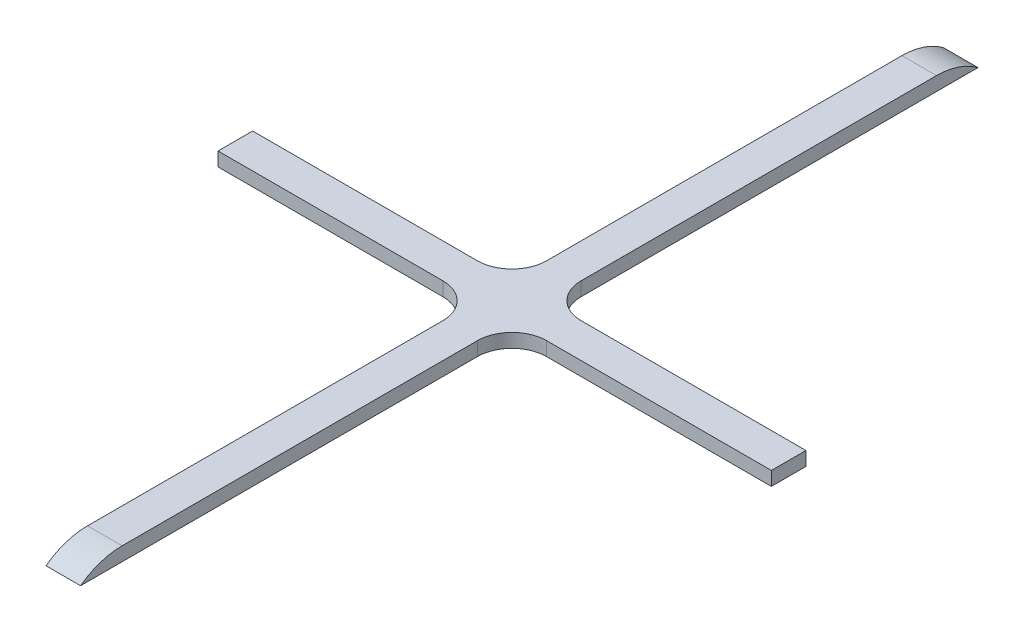
ISO-10303-21;
HEADER;
FILE_DESCRIPTION(('STEP AP214'),'2;1');
FILE_NAME('part.step','',(''),(''),'','','');
FILE_SCHEMA(('AUTOMOTIVE_DESIGN { 1 0 10303 214 1 1 1 1 }'));
ENDSEC;
DATA;
#1=APPLICATION_CONTEXT('core data for automotive mechanical design processes');
#2=APPLICATION_PROTOCOL_DEFINITION('international standard','automotive_design',2000,#1);
#3=PRODUCT_CONTEXT('',#1,'mechanical');
#4=PRODUCT('Part','Part','',(#3));
#5=PRODUCT_RELATED_PRODUCT_CATEGORY('part','',(#4));
#6=PRODUCT_DEFINITION_FORMATION('','',#4);
#7=PRODUCT_DEFINITION_CONTEXT('part definition',#1,'design');
#8=PRODUCT_DEFINITION('design','',#6,#7);
#9=PRODUCT_DEFINITION_SHAPE('','',#8);
#10=(LENGTH_UNIT() NAMED_UNIT(*) SI_UNIT(.MILLI.,.METRE.));
#11=(NAMED_UNIT(*) PLANE_ANGLE_UNIT() SI_UNIT($,.RADIAN.));
#12=(NAMED_UNIT(*) SI_UNIT($,.STERADIAN.) SOLID_ANGLE_UNIT());
#13=UNCERTAINTY_MEASURE_WITH_UNIT(LENGTH_MEASURE(1.E-05),#10,'distance_accuracy_value','');
#14=(GEOMETRIC_REPRESENTATION_CONTEXT(3) GLOBAL_UNCERTAINTY_ASSIGNED_CONTEXT((#13)) GLOBAL_UNIT_ASSIGNED_CONTEXT((#10,
#11,#12)) REPRESENTATION_CONTEXT('',''));
#15=CARTESIAN_POINT('',(0.,0.,0.));
#16=DIRECTION('',(0.,0.,1.));
#17=DIRECTION('',(1.,0.,0.));
#18=AXIS2_PLACEMENT_3D('',#15,#16,#17);
#19=CARTESIAN_POINT('',(5.,20.,-160.249999999999));
#20=DIRECTION('',(1.,0.,0.));
#21=DIRECTION('',(0.,0.,-1.));
#22=AXIS2_PLACEMENT_3D('',#19,#20,#21);
#23=PLANE('',#22);
#24=DIRECTION('',(0.,0.,-1.));
#25=VECTOR('',#24,1.);
#26=CARTESIAN_POINT('',(5.,36.,87.2500000000012));
#27=LINE('',#26,#25);
#28=CARTESIAN_POINT('',(5.,36.,87.2500000000012));
#29=VERTEX_POINT('',#28);
#30=CARTESIAN_POINT('',(5.,36.,-27.4999999999991));
#31=VERTEX_POINT('',#30);
#32=EDGE_CURVE('E195',#29,#31,#27,.T.);
#33=ORIENTED_EDGE('',*,*,#32,.T.);
#34=DIRECTION('',(0.,1.,0.));
#35=VECTOR('',#34,1.);
#36=CARTESIAN_POINT('',(5.,20.,-27.4999999999991));
#37=LINE('',#36,#35);
#38=CARTESIAN_POINT('',(5.,40.,-27.4999999999991));
#39=VERTEX_POINT('',#38);
#40=EDGE_CURVE('E217',#31,#39,#37,.T.);
#41=ORIENTED_EDGE('',*,*,#40,.T.);
#42=DIRECTION('',(0.,0.,1.));
#43=VECTOR('',#42,1.);
#44=CARTESIAN_POINT('',(5.,40.,75.2500000000012));
#45=LINE('',#44,#43);
#46=CARTESIAN_POINT('',(5.,40.,75.2500000000012));
#47=VERTEX_POINT('',#46);
#48=EDGE_CURVE('E187',#39,#47,#45,.T.);
#49=ORIENTED_EDGE('',*,*,#48,.T.);
#50=CARTESIAN_POINT('',(5.,20.,75.2500000000012));
#51=DIRECTION('',(1.,0.,0.));
#52=DIRECTION('',(0.,0.,-1.));
#53=AXIS2_PLACEMENT_3D('',#50,#51,#52);
#54=CIRCLE('',#53,20.);
#55=EDGE_CURVE('E192',#47,#29,#54,.T.);
#56=ORIENTED_EDGE('',*,*,#55,.T.);
#57=EDGE_LOOP('',(#33,#41,#49,#56));
#58=FACE_BOUND('',#57,.T.);
#59=ADVANCED_FACE('F37',(#58),#23,.T.);
#60=CARTESIAN_POINT('',(5.,40.,-160.249999999999));
#61=VERTEX_POINT('',#60);
#62=CARTESIAN_POINT('',(5.,40.,-57.4999999999991));
#63=VERTEX_POINT('',#62);
#64=EDGE_CURVE('E189',#61,#63,#45,.T.);
#65=ORIENTED_EDGE('',*,*,#64,.T.);
#66=DIRECTION('',(0.,-1.,0.));
#67=VECTOR('',#66,1.);
#68=CARTESIAN_POINT('',(5.,20.,-57.4999999999991));
#69=LINE('',#68,#67);
#70=CARTESIAN_POINT('',(5.,36.,-57.4999999999991));
#71=VERTEX_POINT('',#70);
#72=EDGE_CURVE('E221',#63,#71,#69,.T.);
#73=ORIENTED_EDGE('',*,*,#72,.T.);
#74=CARTESIAN_POINT('',(5.,36.,-172.249999999999));
#75=VERTEX_POINT('',#74);
#76=EDGE_CURVE('E194',#71,#75,#27,.T.);
#77=ORIENTED_EDGE('',*,*,#76,.T.);
#78=CARTESIAN_POINT('',(5.,20.,-160.249999999999));
#79=DIRECTION('',(1.,0.,0.));
#80=DIRECTION('',(0.,0.,-1.));
#81=AXIS2_PLACEMENT_3D('',#78,#79,#80);
#82=CIRCLE('',#81,20.);
#83=EDGE_CURVE('E184',#75,#61,#82,.T.);
#84=ORIENTED_EDGE('',*,*,#83,.T.);
#85=EDGE_LOOP('',(#65,#73,#77,#84));
#86=FACE_BOUND('',#85,.T.);
#87=ADVANCED_FACE('F277',(#86),#23,.T.);
#88=CARTESIAN_POINT('',(-5.,20.,-160.249999999999));
#89=DIRECTION('',(1.,0.,0.));
#90=DIRECTION('',(0.,0.,-1.));
#91=AXIS2_PLACEMENT_3D('',#88,#89,#90);
#92=PLANE('',#91);
#93=DIRECTION('',(0.,0.,1.));
#94=VECTOR('',#93,1.);
#95=CARTESIAN_POINT('',(-5.,40.,75.2500000000012));
#96=LINE('',#95,#94);
#97=CARTESIAN_POINT('',(-5.,40.,-27.4999999999991));
#98=VERTEX_POINT('',#97);
#99=CARTESIAN_POINT('',(-5.,40.,75.2500000000012));
#100=VERTEX_POINT('',#99);
#101=EDGE_CURVE('E179',#98,#100,#96,.T.);
#102=ORIENTED_EDGE('',*,*,#101,.F.);
#103=DIRECTION('',(0.,1.,0.));
#104=VECTOR('',#103,1.);
#105=CARTESIAN_POINT('',(-5.,36.,-27.4999999999991));
#106=LINE('',#105,#104);
#107=CARTESIAN_POINT('',(-5.,36.,-27.4999999999991));
#108=VERTEX_POINT('',#107);
#109=EDGE_CURVE('E58',#98,#108,#106,.F.);
#110=ORIENTED_EDGE('',*,*,#109,.T.);
#111=DIRECTION('',(0.,0.,-1.));
#112=VECTOR('',#111,1.);
#113=CARTESIAN_POINT('',(-5.,36.,87.2500000000012));
#114=LINE('',#113,#112);
#115=CARTESIAN_POINT('',(-5.,36.,87.2500000000012));
#116=VERTEX_POINT('',#115);
#117=EDGE_CURVE('E188',#116,#108,#114,.T.);
#118=ORIENTED_EDGE('',*,*,#117,.F.);
#119=CARTESIAN_POINT('',(-5.,20.,75.2500000000012));
#120=DIRECTION('',(1.,0.,0.));
#121=DIRECTION('',(0.,0.,-1.));
#122=AXIS2_PLACEMENT_3D('',#119,#120,#121);
#123=CIRCLE('',#122,20.);
#124=EDGE_CURVE('E202',#100,#116,#123,.T.);
#125=ORIENTED_EDGE('',*,*,#124,.F.);
#126=EDGE_LOOP('',(#102,#110,#118,#125));
#127=FACE_BOUND('',#126,.T.);
#128=ADVANCED_FACE('F317',(#127),#92,.F.);
#129=CARTESIAN_POINT('',(-5.,36.,-57.4999999999991));
#130=VERTEX_POINT('',#129);
#131=CARTESIAN_POINT('',(-5.,36.,-172.249999999999));
#132=VERTEX_POINT('',#131);
#133=EDGE_CURVE('E204',#130,#132,#114,.T.);
#134=ORIENTED_EDGE('',*,*,#133,.F.);
#135=DIRECTION('',(0.,-1.,0.));
#136=VECTOR('',#135,1.);
#137=CARTESIAN_POINT('',(-5.,40.,-57.4999999999991));
#138=LINE('',#137,#136);
#139=CARTESIAN_POINT('',(-5.,40.,-57.4999999999991));
#140=VERTEX_POINT('',#139);
#141=EDGE_CURVE('E229',#130,#140,#138,.F.);
#142=ORIENTED_EDGE('',*,*,#141,.T.);
#143=CARTESIAN_POINT('',(-5.,40.,-160.249999999999));
#144=VERTEX_POINT('',#143);
#145=EDGE_CURVE('E199',#144,#140,#96,.T.);
#146=ORIENTED_EDGE('',*,*,#145,.F.);
#147=CARTESIAN_POINT('',(-5.,20.,-160.249999999999));
#148=DIRECTION('',(1.,0.,0.));
#149=DIRECTION('',(0.,0.,-1.));
#150=AXIS2_PLACEMENT_3D('',#147,#148,#149);
#151=CIRCLE('',#150,20.);
#152=EDGE_CURVE('E175',#132,#144,#151,.T.);
#153=ORIENTED_EDGE('',*,*,#152,.F.);
#154=EDGE_LOOP('',(#134,#142,#146,#153));
#155=FACE_BOUND('',#154,.T.);
#156=ADVANCED_FACE('F270',(#155),#92,.F.);
#157=CARTESIAN_POINT('',(5.,20.,-160.249999999999));
#158=DIRECTION('',(-1.,0.,0.));
#159=DIRECTION('',(0.,0.,1.));
#160=AXIS2_PLACEMENT_3D('',#157,#158,#159);
#161=CYLINDRICAL_SURFACE('',#160,20.);
#162=ORIENTED_EDGE('',*,*,#152,.T.);
#163=DIRECTION('',(-1.,0.,0.));
#164=VECTOR('',#163,1.);
#165=CARTESIAN_POINT('',(5.,40.,-160.249999999999));
#166=LINE('',#165,#164);
#167=EDGE_CURVE('E214',#61,#144,#166,.T.);
#168=ORIENTED_EDGE('',*,*,#167,.F.);
#169=ORIENTED_EDGE('',*,*,#83,.F.);
#170=DIRECTION('',(-1.,0.,0.));
#171=VECTOR('',#170,1.);
#172=CARTESIAN_POINT('',(5.,36.,-172.249999999999));
#173=LINE('',#172,#171);
#174=EDGE_CURVE('E197',#75,#132,#173,.T.);
#175=ORIENTED_EDGE('',*,*,#174,.T.);
#176=EDGE_LOOP('',(#162,#168,#169,#175));
#177=FACE_BOUND('',#176,.T.);
#178=ADVANCED_FACE('F273',(#177),#161,.T.);
#179=CARTESIAN_POINT('',(5.,40.,75.2500000000012));
#180=DIRECTION('',(0.,-1.,0.));
#181=DIRECTION('',(0.,0.,-1.));
#182=AXIS2_PLACEMENT_3D('',#179,#180,#181);
#183=PLANE('',#182);
#184=DIRECTION('',(-1.,0.,0.));
#185=VECTOR('',#184,1.);
#186=CARTESIAN_POINT('',(80.,40.,-47.4999999999991));
#187=LINE('',#186,#185);
#188=CARTESIAN_POINT('',(80.,40.,-47.4999999999991));
#189=VERTEX_POINT('',#188);
#190=CARTESIAN_POINT('',(15.,40.,-47.4999999999991));
#191=VERTEX_POINT('',#190);
#192=EDGE_CURVE('E261',#189,#191,#187,.T.);
#193=ORIENTED_EDGE('',*,*,#192,.T.);
#194=CARTESIAN_POINT('',(15.,40.,-57.4999999999991));
#195=DIRECTION('',(0.,-1.,0.));
#196=DIRECTION('',(0.,0.,-1.));
#197=AXIS2_PLACEMENT_3D('',#194,#195,#196);
#198=CIRCLE('',#197,10.);
#199=EDGE_CURVE('E241',#191,#63,#198,.T.);
#200=ORIENTED_EDGE('',*,*,#199,.T.);
#201=ORIENTED_EDGE('',*,*,#64,.F.);
#202=ORIENTED_EDGE('',*,*,#167,.T.);
#203=ORIENTED_EDGE('',*,*,#145,.T.);
#204=CARTESIAN_POINT('',(-15.,40.,-57.4999999999991));
#205=DIRECTION('',(0.,-1.,0.));
#206=DIRECTION('',(0.,0.,-1.));
#207=AXIS2_PLACEMENT_3D('',#204,#205,#206);
#208=CIRCLE('',#207,10.);
#209=CARTESIAN_POINT('',(-15.,40.,-47.4999999999991));
#210=VERTEX_POINT('',#209);
#211=EDGE_CURVE('E245',#140,#210,#208,.T.);
#212=ORIENTED_EDGE('',*,*,#211,.T.);
#213=CARTESIAN_POINT('',(-80.,40.,-47.4999999999991));
#214=VERTEX_POINT('',#213);
#215=EDGE_CURVE('E251',#210,#214,#187,.T.);
#216=ORIENTED_EDGE('',*,*,#215,.T.);
#217=DIRECTION('',(0.,0.,1.));
#218=VECTOR('',#217,1.);
#219=CARTESIAN_POINT('',(-80.,40.,-37.4999999999991));
#220=LINE('',#219,#218);
#221=CARTESIAN_POINT('',(-80.,40.,-37.4999999999991));
#222=VERTEX_POINT('',#221);
#223=EDGE_CURVE('E170',#214,#222,#220,.T.);
#224=ORIENTED_EDGE('',*,*,#223,.T.);
#225=DIRECTION('',(-1.,0.,0.));
#226=VECTOR('',#225,1.);
#227=CARTESIAN_POINT('',(80.,40.,-37.4999999999991));
#228=LINE('',#227,#226);
#229=CARTESIAN_POINT('',(-15.,40.,-37.4999999999991));
#230=VERTEX_POINT('',#229);
#231=EDGE_CURVE('E288',#230,#222,#228,.T.);
#232=ORIENTED_EDGE('',*,*,#231,.F.);
#233=CARTESIAN_POINT('',(-15.,40.,-27.4999999999991));
#234=DIRECTION('',(0.,-1.,0.));
#235=DIRECTION('',(0.,0.,-1.));
#236=AXIS2_PLACEMENT_3D('',#233,#234,#235);
#237=CIRCLE('',#236,10.);
#238=EDGE_CURVE('E45',#230,#98,#237,.T.);
#239=ORIENTED_EDGE('',*,*,#238,.T.);
#240=ORIENTED_EDGE('',*,*,#101,.T.);
#241=DIRECTION('',(-1.,0.,0.));
#242=VECTOR('',#241,1.);
#243=CARTESIAN_POINT('',(5.,40.,75.2500000000012));
#244=LINE('',#243,#242);
#245=EDGE_CURVE('E211',#47,#100,#244,.T.);
#246=ORIENTED_EDGE('',*,*,#245,.F.);
#247=ORIENTED_EDGE('',*,*,#48,.F.);
#248=CARTESIAN_POINT('',(15.,40.,-27.4999999999991));
#249=DIRECTION('',(0.,-1.,0.));
#250=DIRECTION('',(0.,0.,-1.));
#251=AXIS2_PLACEMENT_3D('',#248,#249,#250);
#252=CIRCLE('',#251,10.);
#253=CARTESIAN_POINT('',(15.,40.,-37.4999999999991));
#254=VERTEX_POINT('',#253);
#255=EDGE_CURVE('E235',#39,#254,#252,.T.);
#256=ORIENTED_EDGE('',*,*,#255,.T.);
#257=CARTESIAN_POINT('',(80.,40.,-37.4999999999991));
#258=VERTEX_POINT('',#257);
#259=EDGE_CURVE('E262',#258,#254,#228,.T.);
#260=ORIENTED_EDGE('',*,*,#259,.F.);
#261=DIRECTION('',(0.,0.,1.));
#262=VECTOR('',#261,1.);
#263=CARTESIAN_POINT('',(80.,40.,-37.4999999999991));
#264=LINE('',#263,#262);
#265=EDGE_CURVE('E166',#189,#258,#264,.T.);
#266=ORIENTED_EDGE('',*,*,#265,.F.);
#267=EDGE_LOOP('',(#193,#200,#201,#202,#203,#212,#216,#224,#232,#239,#240,#246,#247,#256,#260,#266));
#268=FACE_BOUND('',#267,.T.);
#269=ADVANCED_FACE('F249',(#268),#183,.F.);
#270=CARTESIAN_POINT('',(5.,20.,75.2500000000012));
#271=DIRECTION('',(-1.,0.,0.));
#272=DIRECTION('',(0.,0.,1.));
#273=AXIS2_PLACEMENT_3D('',#270,#271,#272);
#274=CYLINDRICAL_SURFACE('',#273,20.);
#275=ORIENTED_EDGE('',*,*,#124,.T.);
#276=DIRECTION('',(-1.,0.,0.));
#277=VECTOR('',#276,1.);
#278=CARTESIAN_POINT('',(5.,36.,87.2500000000012));
#279=LINE('',#278,#277);
#280=EDGE_CURVE('E208',#29,#116,#279,.T.);
#281=ORIENTED_EDGE('',*,*,#280,.F.);
#282=ORIENTED_EDGE('',*,*,#55,.F.);
#283=ORIENTED_EDGE('',*,*,#245,.T.);
#284=EDGE_LOOP('',(#275,#281,#282,#283));
#285=FACE_BOUND('',#284,.T.);
#286=ADVANCED_FACE('F325',(#285),#274,.T.);
#287=CARTESIAN_POINT('',(5.,36.,87.2500000000012));
#288=DIRECTION('',(0.,1.,0.));
#289=DIRECTION('',(0.,0.,1.));
#290=AXIS2_PLACEMENT_3D('',#287,#288,#289);
#291=PLANE('',#290);
#292=DIRECTION('',(-1.,0.,0.));
#293=VECTOR('',#292,1.);
#294=CARTESIAN_POINT('',(80.,36.,-47.4999999999991));
#295=LINE('',#294,#293);
#296=CARTESIAN_POINT('',(-15.,36.,-47.4999999999991));
#297=VERTEX_POINT('',#296);
#298=CARTESIAN_POINT('',(-80.,36.,-47.4999999999991));
#299=VERTEX_POINT('',#298);
#300=EDGE_CURVE('E267',#297,#299,#295,.T.);
#301=ORIENTED_EDGE('',*,*,#300,.F.);
#302=CARTESIAN_POINT('',(-15.,36.,-57.4999999999991));
#303=DIRECTION('',(0.,1.,0.));
#304=DIRECTION('',(0.,0.,1.));
#305=AXIS2_PLACEMENT_3D('',#302,#303,#304);
#306=CIRCLE('',#305,10.);
#307=EDGE_CURVE('E243',#297,#130,#306,.T.);
#308=ORIENTED_EDGE('',*,*,#307,.T.);
#309=ORIENTED_EDGE('',*,*,#133,.T.);
#310=ORIENTED_EDGE('',*,*,#174,.F.);
#311=ORIENTED_EDGE('',*,*,#76,.F.);
#312=CARTESIAN_POINT('',(15.,36.,-57.4999999999991));
#313=DIRECTION('',(0.,1.,0.));
#314=DIRECTION('',(0.,0.,1.));
#315=AXIS2_PLACEMENT_3D('',#312,#313,#314);
#316=CIRCLE('',#315,10.);
#317=CARTESIAN_POINT('',(15.,36.,-47.4999999999991));
#318=VERTEX_POINT('',#317);
#319=EDGE_CURVE('E239',#71,#318,#316,.T.);
#320=ORIENTED_EDGE('',*,*,#319,.T.);
#321=CARTESIAN_POINT('',(80.,36.,-47.4999999999991));
#322=VERTEX_POINT('',#321);
#323=EDGE_CURVE('E157',#322,#318,#295,.T.);
#324=ORIENTED_EDGE('',*,*,#323,.F.);
#325=DIRECTION('',(0.,0.,-1.));
#326=VECTOR('',#325,1.);
#327=CARTESIAN_POINT('',(80.,36.,-37.4999999999991));
#328=LINE('',#327,#326);
#329=CARTESIAN_POINT('',(80.,36.,-37.4999999999991));
#330=VERTEX_POINT('',#329);
#331=EDGE_CURVE('E149',#330,#322,#328,.T.);
#332=ORIENTED_EDGE('',*,*,#331,.F.);
#333=DIRECTION('',(-1.,0.,0.));
#334=VECTOR('',#333,1.);
#335=CARTESIAN_POINT('',(80.,36.,-37.4999999999991));
#336=LINE('',#335,#334);
#337=CARTESIAN_POINT('',(15.,36.,-37.4999999999991));
#338=VERTEX_POINT('',#337);
#339=EDGE_CURVE('E154',#330,#338,#336,.T.);
#340=ORIENTED_EDGE('',*,*,#339,.T.);
#341=CARTESIAN_POINT('',(15.,36.,-27.4999999999991));
#342=DIRECTION('',(0.,1.,0.));
#343=DIRECTION('',(0.,0.,1.));
#344=AXIS2_PLACEMENT_3D('',#341,#342,#343);
#345=CIRCLE('',#344,10.);
#346=EDGE_CURVE('E237',#338,#31,#345,.T.);
#347=ORIENTED_EDGE('',*,*,#346,.T.);
#348=ORIENTED_EDGE('',*,*,#32,.F.);
#349=ORIENTED_EDGE('',*,*,#280,.T.);
#350=ORIENTED_EDGE('',*,*,#117,.T.);
#351=CARTESIAN_POINT('',(-15.,36.,-27.4999999999991));
#352=DIRECTION('',(0.,1.,0.));
#353=DIRECTION('',(0.,0.,1.));
#354=AXIS2_PLACEMENT_3D('',#351,#352,#353);
#355=CIRCLE('',#354,10.);
#356=CARTESIAN_POINT('',(-15.,36.,-37.4999999999991));
#357=VERTEX_POINT('',#356);
#358=EDGE_CURVE('E11',#108,#357,#355,.T.);
#359=ORIENTED_EDGE('',*,*,#358,.T.);
#360=CARTESIAN_POINT('',(-80.,36.,-37.4999999999991));
#361=VERTEX_POINT('',#360);
#362=EDGE_CURVE('E176',#357,#361,#336,.T.);
#363=ORIENTED_EDGE('',*,*,#362,.T.);
#364=DIRECTION('',(0.,0.,-1.));
#365=VECTOR('',#364,1.);
#366=CARTESIAN_POINT('',(-80.,36.,-37.4999999999991));
#367=LINE('',#366,#365);
#368=EDGE_CURVE('E291',#361,#299,#367,.T.);
#369=ORIENTED_EDGE('',*,*,#368,.T.);
#370=EDGE_LOOP('',(#301,#308,#309,#310,#311,#320,#324,#332,#340,#347,#348,#349,#350,#359,#363,#369));
#371=FACE_BOUND('',#370,.T.);
#372=ADVANCED_FACE('F152',(#371),#291,.F.);
#373=CARTESIAN_POINT('',(-80.,0.,0.));
#374=DIRECTION('',(1.,0.,0.));
#375=DIRECTION('',(0.,0.,-1.));
#376=AXIS2_PLACEMENT_3D('',#373,#374,#375);
#377=PLANE('',#376);
#378=DIRECTION('',(0.,-1.,0.));
#379=VECTOR('',#378,1.);
#380=CARTESIAN_POINT('',(-80.,40.,-37.4999999999991));
#381=LINE('',#380,#379);
#382=EDGE_CURVE('E293',#222,#361,#381,.T.);
#383=ORIENTED_EDGE('',*,*,#382,.F.);
#384=ORIENTED_EDGE('',*,*,#223,.F.);
#385=DIRECTION('',(0.,1.,0.));
#386=VECTOR('',#385,1.);
#387=CARTESIAN_POINT('',(-80.,40.,-47.4999999999991));
#388=LINE('',#387,#386);
#389=EDGE_CURVE('E259',#299,#214,#388,.T.);
#390=ORIENTED_EDGE('',*,*,#389,.F.);
#391=ORIENTED_EDGE('',*,*,#368,.F.);
#392=EDGE_LOOP('',(#383,#384,#390,#391));
#393=FACE_BOUND('',#392,.T.);
#394=ADVANCED_FACE('F304',(#393),#377,.F.);
#395=CARTESIAN_POINT('',(80.,40.,-47.4999999999991));
#396=DIRECTION('',(0.,0.,1.));
#397=DIRECTION('',(1.,0.,0.));
#398=AXIS2_PLACEMENT_3D('',#395,#396,#397);
#399=PLANE('',#398);
#400=ORIENTED_EDGE('',*,*,#215,.F.);
#401=DIRECTION('',(0.,-1.,0.));
#402=VECTOR('',#401,1.);
#403=CARTESIAN_POINT('',(-15.,36.,-47.4999999999991));
#404=LINE('',#403,#402);
#405=EDGE_CURVE('E226',#210,#297,#404,.T.);
#406=ORIENTED_EDGE('',*,*,#405,.T.);
#407=ORIENTED_EDGE('',*,*,#300,.T.);
#408=ORIENTED_EDGE('',*,*,#389,.T.);
#409=EDGE_LOOP('',(#400,#406,#407,#408));
#410=FACE_BOUND('',#409,.T.);
#411=ADVANCED_FACE('F257',(#410),#399,.F.);
#412=CARTESIAN_POINT('',(80.,40.,-37.4999999999991));
#413=DIRECTION('',(0.,0.,-1.));
#414=DIRECTION('',(-1.,0.,0.));
#415=AXIS2_PLACEMENT_3D('',#412,#413,#414);
#416=PLANE('',#415);
#417=ORIENTED_EDGE('',*,*,#362,.F.);
#418=DIRECTION('',(0.,1.,0.));
#419=VECTOR('',#418,1.);
#420=CARTESIAN_POINT('',(-15.,40.,-37.4999999999991));
#421=LINE('',#420,#419);
#422=EDGE_CURVE('E231',#357,#230,#421,.T.);
#423=ORIENTED_EDGE('',*,*,#422,.T.);
#424=ORIENTED_EDGE('',*,*,#231,.T.);
#425=ORIENTED_EDGE('',*,*,#382,.T.);
#426=EDGE_LOOP('',(#417,#423,#424,#425));
#427=FACE_BOUND('',#426,.T.);
#428=ADVANCED_FACE('F299',(#427),#416,.F.);
#429=ORIENTED_EDGE('',*,*,#259,.T.);
#430=DIRECTION('',(0.,1.,0.));
#431=VECTOR('',#430,1.);
#432=CARTESIAN_POINT('',(15.,40.,-37.4999999999991));
#433=LINE('',#432,#431);
#434=EDGE_CURVE('E174',#254,#338,#433,.F.);
#435=ORIENTED_EDGE('',*,*,#434,.T.);
#436=ORIENTED_EDGE('',*,*,#339,.F.);
#437=DIRECTION('',(0.,-1.,0.));
#438=VECTOR('',#437,1.);
#439=CARTESIAN_POINT('',(80.,40.,-37.4999999999991));
#440=LINE('',#439,#438);
#441=EDGE_CURVE('E161',#258,#330,#440,.T.);
#442=ORIENTED_EDGE('',*,*,#441,.F.);
#443=EDGE_LOOP('',(#429,#435,#436,#442));
#444=FACE_BOUND('',#443,.T.);
#445=ADVANCED_FACE('F172',(#444),#416,.F.);
#446=ORIENTED_EDGE('',*,*,#323,.T.);
#447=DIRECTION('',(0.,-1.,0.));
#448=VECTOR('',#447,1.);
#449=CARTESIAN_POINT('',(15.,40.,-47.4999999999991));
#450=LINE('',#449,#448);
#451=EDGE_CURVE('E224',#318,#191,#450,.F.);
#452=ORIENTED_EDGE('',*,*,#451,.T.);
#453=ORIENTED_EDGE('',*,*,#192,.F.);
#454=DIRECTION('',(0.,1.,0.));
#455=VECTOR('',#454,1.);
#456=CARTESIAN_POINT('',(80.,40.,-47.4999999999991));
#457=LINE('',#456,#455);
#458=EDGE_CURVE('E160',#322,#189,#457,.T.);
#459=ORIENTED_EDGE('',*,*,#458,.F.);
#460=EDGE_LOOP('',(#446,#452,#453,#459));
#461=FACE_BOUND('',#460,.T.);
#462=ADVANCED_FACE('F285',(#461),#399,.F.);
#463=CARTESIAN_POINT('',(80.,0.,0.));
#464=DIRECTION('',(1.,0.,0.));
#465=DIRECTION('',(0.,0.,-1.));
#466=AXIS2_PLACEMENT_3D('',#463,#464,#465);
#467=PLANE('',#466);
#468=ORIENTED_EDGE('',*,*,#441,.T.);
#469=ORIENTED_EDGE('',*,*,#331,.T.);
#470=ORIENTED_EDGE('',*,*,#458,.T.);
#471=ORIENTED_EDGE('',*,*,#265,.T.);
#472=EDGE_LOOP('',(#468,#469,#470,#471));
#473=FACE_BOUND('',#472,.T.);
#474=ADVANCED_FACE('F164',(#473),#467,.T.);
#475=CARTESIAN_POINT('',(15.,20.,-27.4999999999991));
#476=DIRECTION('',(0.,1.,0.));
#477=DIRECTION('',(0.,0.,1.));
#478=AXIS2_PLACEMENT_3D('',#475,#476,#477);
#479=CYLINDRICAL_SURFACE('',#478,10.);
#480=ORIENTED_EDGE('',*,*,#346,.F.);
#481=ORIENTED_EDGE('',*,*,#434,.F.);
#482=ORIENTED_EDGE('',*,*,#255,.F.);
#483=ORIENTED_EDGE('',*,*,#40,.F.);
#484=EDGE_LOOP('',(#480,#481,#482,#483));
#485=FACE_BOUND('',#484,.T.);
#486=ADVANCED_FACE('F333',(#485),#479,.F.);
#487=CARTESIAN_POINT('',(15.,20.,-57.4999999999991));
#488=DIRECTION('',(0.,-1.,0.));
#489=DIRECTION('',(0.,0.,-1.));
#490=AXIS2_PLACEMENT_3D('',#487,#488,#489);
#491=CYLINDRICAL_SURFACE('',#490,10.);
#492=ORIENTED_EDGE('',*,*,#199,.F.);
#493=ORIENTED_EDGE('',*,*,#451,.F.);
#494=ORIENTED_EDGE('',*,*,#319,.F.);
#495=ORIENTED_EDGE('',*,*,#72,.F.);
#496=EDGE_LOOP('',(#492,#493,#494,#495));
#497=FACE_BOUND('',#496,.T.);
#498=ADVANCED_FACE('F281',(#497),#491,.F.);
#499=CARTESIAN_POINT('',(-15.,40.,-57.4999999999991));
#500=DIRECTION('',(0.,1.,0.));
#501=DIRECTION('',(0.,0.,1.));
#502=AXIS2_PLACEMENT_3D('',#499,#500,#501);
#503=CYLINDRICAL_SURFACE('',#502,10.);
#504=ORIENTED_EDGE('',*,*,#211,.F.);
#505=ORIENTED_EDGE('',*,*,#141,.F.);
#506=ORIENTED_EDGE('',*,*,#307,.F.);
#507=ORIENTED_EDGE('',*,*,#405,.F.);
#508=EDGE_LOOP('',(#504,#505,#506,#507));
#509=FACE_BOUND('',#508,.T.);
#510=ADVANCED_FACE('F263',(#509),#503,.F.);
#511=CARTESIAN_POINT('',(-15.,40.,-27.4999999999991));
#512=DIRECTION('',(0.,-1.,0.));
#513=DIRECTION('',(0.,0.,-1.));
#514=AXIS2_PLACEMENT_3D('',#511,#512,#513);
#515=CYLINDRICAL_SURFACE('',#514,10.);
#516=ORIENTED_EDGE('',*,*,#358,.F.);
#517=ORIENTED_EDGE('',*,*,#109,.F.);
#518=ORIENTED_EDGE('',*,*,#238,.F.);
#519=ORIENTED_EDGE('',*,*,#422,.F.);
#520=EDGE_LOOP('',(#516,#517,#518,#519));
#521=FACE_BOUND('',#520,.T.);
#522=ADVANCED_FACE('F39',(#521),#515,.F.);
#523=CLOSED_SHELL('',(#59,#87,#128,#156,#178,#269,#286,#372,#394,#411,#428,#445,#462,#474,#486,
#498,#510,#522));
#524=MANIFOLD_SOLID_BREP('B2',#523);
#525=ADVANCED_BREP_SHAPE_REPRESENTATION('',(#18,#524),#14);
#526=SHAPE_DEFINITION_REPRESENTATION(#9,#525);
ENDSEC;
END-ISO-10303-21;
